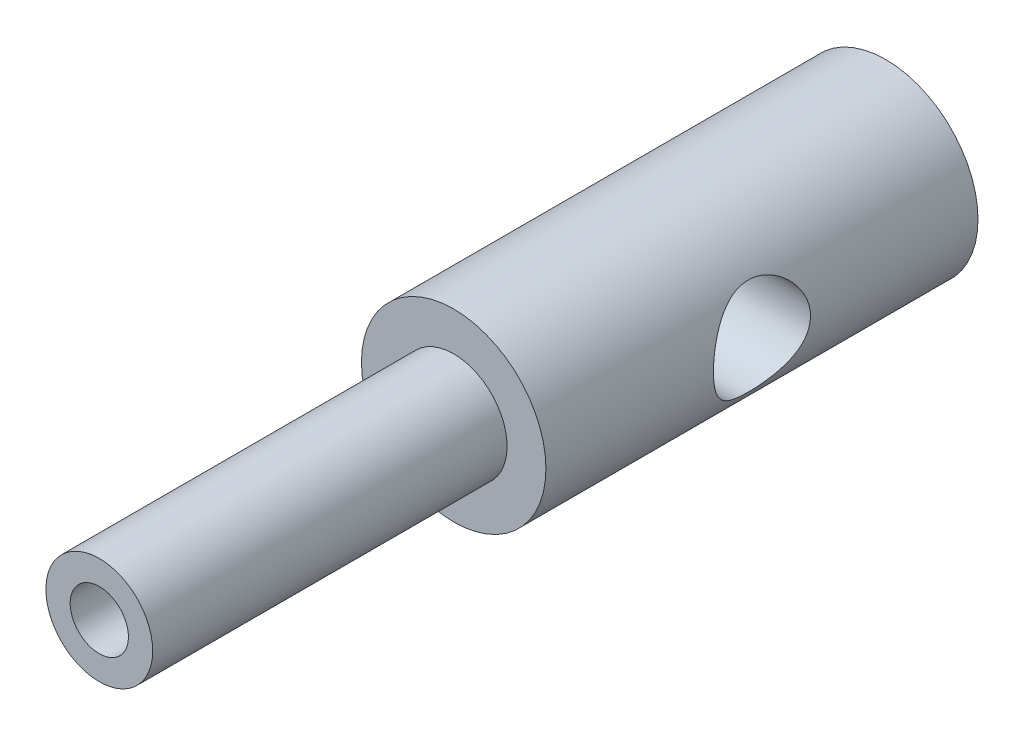
ISO-10303-21;
HEADER;
FILE_DESCRIPTION(('STEP AP214'),'2;1');
FILE_NAME('part.step','',(''),(''),'','','');
FILE_SCHEMA(('AUTOMOTIVE_DESIGN { 1 0 10303 214 1 1 1 1 }'));
ENDSEC;
DATA;
#1=APPLICATION_CONTEXT('core data for automotive mechanical design processes');
#2=APPLICATION_PROTOCOL_DEFINITION('international standard','automotive_design',2000,#1);
#3=PRODUCT_CONTEXT('',#1,'mechanical');
#4=PRODUCT('Part','Part','',(#3));
#5=PRODUCT_RELATED_PRODUCT_CATEGORY('part','',(#4));
#6=PRODUCT_DEFINITION_FORMATION('','',#4);
#7=PRODUCT_DEFINITION_CONTEXT('part definition',#1,'design');
#8=PRODUCT_DEFINITION('design','',#6,#7);
#9=PRODUCT_DEFINITION_SHAPE('','',#8);
#10=(LENGTH_UNIT() NAMED_UNIT(*) SI_UNIT(.MILLI.,.METRE.));
#11=(NAMED_UNIT(*) PLANE_ANGLE_UNIT() SI_UNIT($,.RADIAN.));
#12=(NAMED_UNIT(*) SI_UNIT($,.STERADIAN.) SOLID_ANGLE_UNIT());
#13=UNCERTAINTY_MEASURE_WITH_UNIT(LENGTH_MEASURE(1.E-05),#10,'distance_accuracy_value','');
#14=(GEOMETRIC_REPRESENTATION_CONTEXT(3) GLOBAL_UNCERTAINTY_ASSIGNED_CONTEXT((#13)) GLOBAL_UNIT_ASSIGNED_CONTEXT((#10,
#11,#12)) REPRESENTATION_CONTEXT('',''));
#15=CARTESIAN_POINT('',(0.,0.,0.));
#16=DIRECTION('',(0.,0.,1.));
#17=DIRECTION('',(1.,0.,0.));
#18=AXIS2_PLACEMENT_3D('',#15,#16,#17);
#19=CARTESIAN_POINT('',(0.,0.,36.6134723107493));
#20=DIRECTION('',(0.,0.,1.));
#21=DIRECTION('',(1.,0.,0.));
#22=AXIS2_PLACEMENT_3D('',#19,#20,#21);
#23=CYLINDRICAL_SURFACE('',#22,1.524);
#24=CARTESIAN_POINT('',(0.,0.,11.303));
#25=DIRECTION('',(0.,0.,1.));
#26=DIRECTION('',(1.,0.,0.));
#27=AXIS2_PLACEMENT_3D('',#24,#25,#26);
#28=CIRCLE('',#27,1.524);
#29=CARTESIAN_POINT('',(1.524,0.,11.303));
#30=VERTEX_POINT('',#29);
#31=EDGE_CURVE('E11',#30,#30,#28,.T.);
#32=ORIENTED_EDGE('',*,*,#31,.F.);
#33=EDGE_LOOP('',(#32));
#34=FACE_BOUND('',#33,.T.);
#35=CARTESIAN_POINT('',(0.,0.,29.845));
#36=DIRECTION('',(0.,0.,1.));
#37=DIRECTION('',(1.,0.,0.));
#38=AXIS2_PLACEMENT_3D('',#35,#36,#37);
#39=CIRCLE('',#38,1.524);
#40=CARTESIAN_POINT('',(1.524,0.,29.845));
#41=VERTEX_POINT('',#40);
#42=EDGE_CURVE('E63',#41,#41,#39,.T.);
#43=ORIENTED_EDGE('',*,*,#42,.T.);
#44=EDGE_LOOP('',(#43));
#45=FACE_BOUND('',#44,.T.);
#46=ADVANCED_FACE('F31',(#34,#45),#23,.F.);
#47=CARTESIAN_POINT('',(0.,1.524,11.303));
#48=DIRECTION('',(0.,0.,-1.));
#49=DIRECTION('',(-1.,0.,0.));
#50=AXIS2_PLACEMENT_3D('',#47,#48,#49);
#51=PLANE('',#50);
#52=ORIENTED_EDGE('',*,*,#31,.T.);
#53=EDGE_LOOP('',(#52));
#54=FACE_BOUND('',#53,.T.);
#55=ADVANCED_FACE('F43',(#54),#51,.F.);
#56=CARTESIAN_POINT('',(0.210398319920231,0.,-1.34864201962109));
#57=DIRECTION('',(0.,-1.,0.));
#58=DIRECTION('',(1.,0.,0.));
#59=AXIS2_PLACEMENT_3D('',#56,#57,#58);
#60=CIRCLE('',#59,10.9723753887063);
#61=TRIMMED_CURVE('',#60,(PARAMETER_VALUE(-1.58997277749052)),
(PARAMETER_VALUE(1.58997277749052)),.T.,.PARAMETER.);
#62=CARTESIAN_POINT('',(0.,0.,-1.34864201962109));
#63=DIRECTION('',(0.,0.,1.));
#64=AXIS1_PLACEMENT('',#62,#63);
#65=SURFACE_OF_REVOLUTION('',#61,#64);
#66=CARTESIAN_POINT('',(0.,0.,-11.303));
#67=DIRECTION('',(0.,0.,1.));
#68=DIRECTION('',(1.,0.,0.));
#69=AXIS2_PLACEMENT_3D('',#66,#67,#68);
#70=CIRCLE('',#69,4.826);
#71=CARTESIAN_POINT('',(4.826,0.,-11.303));
#72=VERTEX_POINT('',#71);
#73=EDGE_CURVE('E37',#72,#72,#70,.T.);
#74=ORIENTED_EDGE('',*,*,#73,.F.);
#75=EDGE_LOOP('',(#74));
#76=FACE_BOUND('',#75,.T.);
#77=CARTESIAN_POINT('',(0.,0.,-12.319));
#78=VERTEX_POINT('',#77);
#79=VERTEX_LOOP('',#78);
#80=FACE_BOUND('',#79,.T.);
#81=ADVANCED_FACE('F40',(#76,#80),#65,.T.);
#82=CARTESIAN_POINT('',(0.,0.,36.6134723107493));
#83=DIRECTION('',(0.,0.,1.));
#84=DIRECTION('',(1.,0.,0.));
#85=AXIS2_PLACEMENT_3D('',#82,#83,#84);
#86=CYLINDRICAL_SURFACE('',#85,4.826);
#87=CARTESIAN_POINT('',(-4.826,0.,-2.54));
#88=CARTESIAN_POINT('',(-4.82599108722361,0.132671727413436,-2.53998970239344));
#89=CARTESIAN_POINT('',(-4.82047125156288,0.265481968353217,-2.52954357726874));
#90=CARTESIAN_POINT('',(-4.79893032203788,0.527119821613084,-2.48824304450853));
#91=CARTESIAN_POINT('',(-4.78289216641369,0.655940606494487,-2.45735547808212));
#92=CARTESIAN_POINT('',(-4.7419816922442,0.905431289774782,-2.37674403171466));
#93=CARTESIAN_POINT('',(-4.71714487204603,1.02613165516498,-2.32709578912966));
#94=CARTESIAN_POINT('',(-4.66086863610746,1.25727953018631,-2.21079285628327));
#95=CARTESIAN_POINT('',(-4.62942930184638,1.36772716631853,-2.14413837588774));
#96=CARTESIAN_POINT('',(-4.56038023318126,1.5832989798215,-1.99082406976726));
#97=CARTESIAN_POINT('',(-4.52250238950114,1.68761176994581,-1.90314624917141));
#98=CARTESIAN_POINT('',(-4.44563295884892,1.88081258984201,-1.71247923080912));
#99=CARTESIAN_POINT('',(-4.4066404564786,1.96968749142896,-1.60947713830809));
#100=CARTESIAN_POINT('',(-4.32795611021071,2.1373780367139,-1.38026510829494));
#101=CARTESIAN_POINT('',(-4.28850606243428,2.21461446655133,-1.25280939787052));
#102=CARTESIAN_POINT('',(-4.2179379601073,2.34625321505091,-0.984350884530217));
#103=CARTESIAN_POINT('',(-4.18681355758633,2.40067294859597,-0.843358514883821));
#104=CARTESIAN_POINT('',(-4.15092654717635,2.46182491483836,-0.629364435915659));
#105=CARTESIAN_POINT('',(-4.14093754389936,2.47854123230209,-0.559963251692714));
#106=CARTESIAN_POINT('',(-4.1243090393974,2.50611551780559,-0.41962701740498));
#107=CARTESIAN_POINT('',(-4.11766766376968,2.51697676445226,-0.348692848945094));
#108=CARTESIAN_POINT('',(-4.10804505946568,2.53265234988395,-0.205965434651406));
#109=CARTESIAN_POINT('',(-4.1050610127179,2.53747134445475,-0.134172893344674));
#110=CARTESIAN_POINT('',(-4.10287559704393,2.54100092747068,0.00959608356973793));
#111=CARTESIAN_POINT('',(-4.10367379235338,2.539712219604,0.0815724970379407));
#112=CARTESIAN_POINT('',(-4.11099346238332,2.52787067626693,0.277161496402171));
#113=CARTESIAN_POINT('',(-4.12124856777439,2.51127256309405,0.400333711927561));
#114=CARTESIAN_POINT('',(-4.15163246424047,2.46070324540304,0.641710718396217));
#115=CARTESIAN_POINT('',(-4.1717650305969,2.42672539793513,0.759913591228928));
#116=CARTESIAN_POINT('',(-4.22001621717023,2.34182911069649,0.991456040571426));
#117=CARTESIAN_POINT('',(-4.24830604698801,2.29054297408753,1.10462387686321));
#118=CARTESIAN_POINT('',(-4.30972258399316,2.17277977330617,1.32130894809646));
#119=CARTESIAN_POINT('',(-4.34285144686724,2.10629593138129,1.42482184811691));
#120=CARTESIAN_POINT('',(-4.41590404440184,1.94900130669127,1.63479698245392));
#121=CARTESIAN_POINT('',(-4.45612325057126,1.85607382057027,1.73957678842223));
#122=CARTESIAN_POINT('',(-4.53504609144926,1.65390878409477,1.93280964630199));
#123=CARTESIAN_POINT('',(-4.57374883592344,1.54466182929683,2.0212532179472));
#124=CARTESIAN_POINT('',(-4.64793424817353,1.30519956619788,2.18407094319797));
#125=CARTESIAN_POINT('',(-4.68311075985481,1.17414752651852,2.25736570848074));
#126=CARTESIAN_POINT('',(-4.74355741798229,0.899262991981225,2.38023808097473));
#127=CARTESIAN_POINT('',(-4.7688361996899,0.755441772593108,2.4298363705033));
#128=CARTESIAN_POINT('',(-4.80471527813416,0.472722667108751,2.49948333378024));
#129=CARTESIAN_POINT('',(-4.81641616290188,0.334514568146813,2.52175772939615));
#130=CARTESIAN_POINT('',(-4.8276865625482,0.0558527783641373,2.54322137881605));
#131=CARTESIAN_POINT('',(-4.82726280425544,-0.0845996240720168,2.5424234332982));
#132=CARTESIAN_POINT('',(-4.81492800330122,-0.350603677123995,2.51891467385047));
#133=CARTESIAN_POINT('',(-4.80402920096687,-0.476380559113346,2.49813470503691));
#134=CARTESIAN_POINT('',(-4.77324084183485,-0.722369844174469,2.43840228679882));
#135=CARTESIAN_POINT('',(-4.75335033850668,-0.842581659958696,2.39944792419428));
#136=CARTESIAN_POINT('',(-4.70570362306431,-1.07768192077833,2.30363604311726));
#137=CARTESIAN_POINT('',(-4.67775740611376,-1.19235248320353,2.2463418336659));
#138=CARTESIAN_POINT('',(-4.61658115367783,-1.41079460303505,2.11599988396211));
#139=CARTESIAN_POINT('',(-4.58334900910351,-1.51456178242331,2.04294585136614));
#140=CARTESIAN_POINT('',(-4.51056899207539,-1.71992089838233,1.87428532218791));
#141=CARTESIAN_POINT('',(-4.47072488885432,-1.82012168188046,1.7771106683904));
#142=CARTESIAN_POINT('',(-4.39161535325803,-2.00349303005818,1.56749253156448));
#143=CARTESIAN_POINT('',(-4.35235045587152,-2.0866486657826,1.4550358058891));
#144=CARTESIAN_POINT('',(-4.27626873612259,-2.23863312746198,1.2092490958132));
#145=CARTESIAN_POINT('',(-4.23976290684386,-2.30622622810844,1.07504960341396));
#146=CARTESIAN_POINT('',(-4.17752001419265,-2.41716789962534,0.794695862482454));
#147=CARTESIAN_POINT('',(-4.15176786635105,-2.46055046020459,0.648558705838511));
#148=CARTESIAN_POINT('',(-4.11739808639077,-2.51760249387967,0.363675373489684));
#149=CARTESIAN_POINT('',(-4.10734939485993,-2.53376580050266,0.225606978035502));
#150=CARTESIAN_POINT('',(-4.10148663761561,-2.54325251426608,-0.0515809174025368));
#151=CARTESIAN_POINT('',(-4.1056637598048,-2.53659006067524,-0.190699713445184));
#152=CARTESIAN_POINT('',(-4.12620301378974,-2.50300230205977,-0.448951627509829));
#153=CARTESIAN_POINT('',(-4.14109936774955,-2.47851068736586,-0.568534724852922));
#154=CARTESIAN_POINT('',(-4.17949142848085,-2.41320402180758,-0.801694164588604));
#155=CARTESIAN_POINT('',(-4.20299020945348,-2.37238313495859,-0.915268342980242));
#156=CARTESIAN_POINT('',(-4.25779154310853,-2.27264506312202,-1.1414706890733));
#157=CARTESIAN_POINT('',(-4.28950382647725,-2.21271932272514,-1.25355163999133));
#158=CARTESIAN_POINT('',(-4.35659981236126,-2.07750163519703,-1.46681674545683));
#159=CARTESIAN_POINT('',(-4.39198548552193,-2.00220141903645,-1.56799499115046));
#160=CARTESIAN_POINT('',(-4.46834947534946,-1.82607748017308,-1.77131408918365));
#161=CARTESIAN_POINT('',(-4.50941880200115,-1.72315801129811,-1.87161677105064));
#162=CARTESIAN_POINT('',(-4.58813890577827,-1.50105472683695,-2.05404906399512));
#163=CARTESIAN_POINT('',(-4.6257875521105,-1.38186088782291,-2.13616739291605));
#164=CARTESIAN_POINT('',(-4.69446936096672,-1.12690740795523,-2.2811267123878));
#165=CARTESIAN_POINT('',(-4.72535358335465,-0.99086185289248,-2.34354494529409));
#166=CARTESIAN_POINT('',(-4.76324157534271,-0.779091866608896,-2.41872771659057));
#167=CARTESIAN_POINT('',(-4.77446007764587,-0.707266167684351,-2.4407064530313));
#168=CARTESIAN_POINT('',(-4.79377695581443,-0.56156955482265,-2.47828286621761));
#169=CARTESIAN_POINT('',(-4.80187710019156,-0.487699825671372,-2.49388416010818));
#170=CARTESIAN_POINT('',(-4.81413367707863,-0.345056283253462,-2.51739912695292));
#171=CARTESIAN_POINT('',(-4.81857144462222,-0.276396846858169,-2.52586263820205));
#172=CARTESIAN_POINT('',(-4.82450696018622,-0.138504200911834,-2.53716581529406));
#173=CARTESIAN_POINT('',(-4.82600465356692,-0.0692709807213348,-2.54000537661881));
#174=CARTESIAN_POINT('',(-4.826,0.,-2.54));
#175=B_SPLINE_CURVE_WITH_KNOTS('',3,(#87,#88,#89,#90,#91,#92,#93,#94,#95,#96,#97,#98,#99,#100,
#101,#102,#103,#104,#105,#106,#107,#108,#109,#110,#111,#112,#113,#114,#115,#116,#117,#118,#119,
#120,#121,#122,#123,#124,#125,#126,#127,#128,#129,#130,#131,#132,#133,#134,#135,#136,#137,#138,
#139,#140,#141,#142,#143,#144,#145,#146,#147,#148,#149,#150,#151,#152,#153,#154,#155,#156,#157,
#158,#159,#160,#161,#162,#163,#164,#165,#166,#167,#168,#169,#170,#171,#172,#173,#174),
.UNSPECIFIED.,.T.,.F.,(4,2,2,2,2,2,2,2,2,2,2,2,2,2,2,2,2,2,2,2,2,2,2,2,2,2,2,2,2,2,2,2,2,2,2,2,
2,2,2,2,2,2,2,4),(0.,0.397746322124852,0.796139429390454,1.19294318340143,1.58974204088334,
2.01230703227597,2.43522962684964,2.89546398653495,3.35534642925026,3.57131730828118,
3.78716712625361,4.0028505212892,4.21850906734589,4.59069978173493,4.96303286273313,
5.34383371635714,5.72480472900837,6.16007486603841,6.59559681142577,7.05576432470947,
7.51552946608198,7.93462648338877,8.35349098753117,8.73556505635372,9.11767935438354,
9.50966949331942,9.90181643076405,10.3354440624032,10.7694498781607,11.230852131371,
11.6916049716728,12.1072345058252,12.5226066275275,12.8899184507141,13.2573616664124,
13.6488257313868,14.0405008991967,14.4868650082089,14.9335052847162,15.3891646870736,
15.6167064519079,15.8441189803958,16.0517876850923,16.259460249165),.UNSPECIFIED.);
#176=CARTESIAN_POINT('',(-4.826,0.,-2.54));
#177=VERTEX_POINT('',#176);
#178=EDGE_CURVE('E66',#177,#177,#175,.T.);
#179=ORIENTED_EDGE('',*,*,#178,.T.);
#180=EDGE_LOOP('',(#179));
#181=FACE_BOUND('',#180,.T.);
#182=CARTESIAN_POINT('',(4.826,0.,-2.54));
#183=CARTESIAN_POINT('',(4.82599108722361,-0.132671727413436,-2.53998970239344));
#184=CARTESIAN_POINT('',(4.82047125156288,-0.265481968353217,-2.52954357726874));
#185=CARTESIAN_POINT('',(4.79893032203788,-0.527119821613084,-2.48824304450853));
#186=CARTESIAN_POINT('',(4.78289216641369,-0.655940606494487,-2.45735547808212));
#187=CARTESIAN_POINT('',(4.7419816922442,-0.905431289774781,-2.37674403171466));
#188=CARTESIAN_POINT('',(4.71714487204603,-1.02613165516498,-2.32709578912966));
#189=CARTESIAN_POINT('',(4.66086863610746,-1.25727953018631,-2.21079285628327));
#190=CARTESIAN_POINT('',(4.62942930184638,-1.36772716631853,-2.14413837588774));
#191=CARTESIAN_POINT('',(4.56038023318127,-1.58329897982149,-1.99082406976726));
#192=CARTESIAN_POINT('',(4.52250238950114,-1.68761176994581,-1.90314624917141));
#193=CARTESIAN_POINT('',(4.44563295884892,-1.88081258984201,-1.71247923080912));
#194=CARTESIAN_POINT('',(4.4066404564786,-1.96968749142896,-1.60947713830809));
#195=CARTESIAN_POINT('',(4.32795611021071,-2.1373780367139,-1.38026510829494));
#196=CARTESIAN_POINT('',(4.28850606243428,-2.21461446655133,-1.25280939787052));
#197=CARTESIAN_POINT('',(4.2179379601073,-2.34625321505091,-0.984350884530217));
#198=CARTESIAN_POINT('',(4.18681355758633,-2.40067294859597,-0.843358514883821));
#199=CARTESIAN_POINT('',(4.15092654717635,-2.46182491483836,-0.629364435915659));
#200=CARTESIAN_POINT('',(4.14093754389936,-2.47854123230209,-0.559963251692714));
#201=CARTESIAN_POINT('',(4.1243090393974,-2.50611551780559,-0.41962701740498));
#202=CARTESIAN_POINT('',(4.11766766376968,-2.51697676445226,-0.348692848945094));
#203=CARTESIAN_POINT('',(4.10804505946568,-2.53265234988395,-0.205965434651406));
#204=CARTESIAN_POINT('',(4.1050610127179,-2.53747134445475,-0.134172893344674));
#205=CARTESIAN_POINT('',(4.10287559704393,-2.54100092747068,0.00959608356973811));
#206=CARTESIAN_POINT('',(4.10367379235338,-2.539712219604,0.0815724970379407));
#207=CARTESIAN_POINT('',(4.11099346238332,-2.52787067626693,0.277161496402171));
#208=CARTESIAN_POINT('',(4.12124856777439,-2.51127256309405,0.400333711927561));
#209=CARTESIAN_POINT('',(4.15163246424047,-2.46070324540304,0.641710718396217));
#210=CARTESIAN_POINT('',(4.1717650305969,-2.42672539793513,0.759913591228928));
#211=CARTESIAN_POINT('',(4.22001621717023,-2.34182911069649,0.991456040571426));
#212=CARTESIAN_POINT('',(4.24830604698801,-2.29054297408753,1.10462387686321));
#213=CARTESIAN_POINT('',(4.30972258399316,-2.17277977330617,1.32130894809646));
#214=CARTESIAN_POINT('',(4.34285144686724,-2.10629593138129,1.42482184811691));
#215=CARTESIAN_POINT('',(4.41590404440184,-1.94900130669127,1.63479698245392));
#216=CARTESIAN_POINT('',(4.45612325057126,-1.85607382057027,1.73957678842222));
#217=CARTESIAN_POINT('',(4.53504609144926,-1.65390878409477,1.93280964630199));
#218=CARTESIAN_POINT('',(4.57374883592344,-1.54466182929683,2.0212532179472));
#219=CARTESIAN_POINT('',(4.64793424817353,-1.30519956619788,2.18407094319797));
#220=CARTESIAN_POINT('',(4.68311075985481,-1.17414752651852,2.25736570848074));
#221=CARTESIAN_POINT('',(4.74355741798229,-0.899262991981224,2.38023808097473));
#222=CARTESIAN_POINT('',(4.7688361996899,-0.755441772593108,2.4298363705033));
#223=CARTESIAN_POINT('',(4.80471527813416,-0.47272266710875,2.49948333378024));
#224=CARTESIAN_POINT('',(4.81641616290188,-0.334514568146813,2.52175772939615));
#225=CARTESIAN_POINT('',(4.8276865625482,-0.0558527783641363,2.54322137881605));
#226=CARTESIAN_POINT('',(4.82726280425544,0.0845996240720178,2.5424234332982));
#227=CARTESIAN_POINT('',(4.81492800330122,0.350603677123996,2.51891467385046));
#228=CARTESIAN_POINT('',(4.80402920096687,0.476380559113348,2.49813470503691));
#229=CARTESIAN_POINT('',(4.77324084183485,0.72236984417447,2.43840228679882));
#230=CARTESIAN_POINT('',(4.75335033850668,0.842581659958697,2.39944792419428));
#231=CARTESIAN_POINT('',(4.70570362306431,1.07768192077834,2.30363604311726));
#232=CARTESIAN_POINT('',(4.67775740611376,1.19235248320353,2.2463418336659));
#233=CARTESIAN_POINT('',(4.61658115367783,1.41079460303505,2.11599988396211));
#234=CARTESIAN_POINT('',(4.58334900910351,1.51456178242331,2.04294585136613));
#235=CARTESIAN_POINT('',(4.51056899207539,1.71992089838233,1.87428532218791));
#236=CARTESIAN_POINT('',(4.47072488885432,1.82012168188046,1.7771106683904));
#237=CARTESIAN_POINT('',(4.39161535325803,2.00349303005818,1.56749253156448));
#238=CARTESIAN_POINT('',(4.35235045587152,2.0866486657826,1.4550358058891));
#239=CARTESIAN_POINT('',(4.27626873612259,2.23863312746198,1.20924909581319));
#240=CARTESIAN_POINT('',(4.23976290684386,2.30622622810844,1.07504960341396));
#241=CARTESIAN_POINT('',(4.17752001419265,2.41716789962534,0.794695862482452));
#242=CARTESIAN_POINT('',(4.15176786635105,2.46055046020459,0.648558705838509));
#243=CARTESIAN_POINT('',(4.11739808639077,2.51760249387967,0.363675373489683));
#244=CARTESIAN_POINT('',(4.10734939485993,2.53376580050266,0.225606978035502));
#245=CARTESIAN_POINT('',(4.10148663761561,2.54325251426608,-0.0515809174025368));
#246=CARTESIAN_POINT('',(4.1056637598048,2.53659006067524,-0.190699713445184));
#247=CARTESIAN_POINT('',(4.12620301378974,2.50300230205977,-0.448951627509829));
#248=CARTESIAN_POINT('',(4.14109936774955,2.47851068736586,-0.568534724852922));
#249=CARTESIAN_POINT('',(4.17949142848085,2.41320402180758,-0.801694164588605));
#250=CARTESIAN_POINT('',(4.20299020945348,2.37238313495858,-0.915268342980242));
#251=CARTESIAN_POINT('',(4.25779154310853,2.27264506312202,-1.1414706890733));
#252=CARTESIAN_POINT('',(4.28950382647725,2.21271932272514,-1.25355163999133));
#253=CARTESIAN_POINT('',(4.35659981236126,2.07750163519703,-1.46681674545683));
#254=CARTESIAN_POINT('',(4.39198548552193,2.00220141903645,-1.56799499115046));
#255=CARTESIAN_POINT('',(4.46834947534946,1.82607748017308,-1.77131408918365));
#256=CARTESIAN_POINT('',(4.50941880200115,1.72315801129811,-1.87161677105064));
#257=CARTESIAN_POINT('',(4.58813890577827,1.50105472683695,-2.05404906399512));
#258=CARTESIAN_POINT('',(4.6257875521105,1.38186088782291,-2.13616739291605));
#259=CARTESIAN_POINT('',(4.69446936096672,1.12690740795523,-2.2811267123878));
#260=CARTESIAN_POINT('',(4.72535358335465,0.99086185289248,-2.34354494529409));
#261=CARTESIAN_POINT('',(4.76324157534271,0.779091866608896,-2.41872771659057));
#262=CARTESIAN_POINT('',(4.77446007764587,0.707266167684351,-2.4407064530313));
#263=CARTESIAN_POINT('',(4.79377695581443,0.561569554822649,-2.47828286621761));
#264=CARTESIAN_POINT('',(4.80187710019156,0.487699825671372,-2.49388416010818));
#265=CARTESIAN_POINT('',(4.81413367707863,0.34505628325346,-2.51739912695292));
#266=CARTESIAN_POINT('',(4.81857144462222,0.276396846858167,-2.52586263820205));
#267=CARTESIAN_POINT('',(4.82450696018622,0.138504200911831,-2.53716581529406));
#268=CARTESIAN_POINT('',(4.82600465356692,0.0692709807213336,-2.54000537661881));
#269=CARTESIAN_POINT('',(4.826,0.,-2.54));
#270=B_SPLINE_CURVE_WITH_KNOTS('',3,(#182,#183,#184,#185,#186,#187,#188,#189,#190,#191,#192,
#193,#194,#195,#196,#197,#198,#199,#200,#201,#202,#203,#204,#205,#206,#207,#208,#209,#210,#211,
#212,#213,#214,#215,#216,#217,#218,#219,#220,#221,#222,#223,#224,#225,#226,#227,#228,#229,#230,
#231,#232,#233,#234,#235,#236,#237,#238,#239,#240,#241,#242,#243,#244,#245,#246,#247,#248,#249,
#250,#251,#252,#253,#254,#255,#256,#257,#258,#259,#260,#261,#262,#263,#264,#265,#266,#267,#268,
#269),.UNSPECIFIED.,.T.,.F.,(4,2,2,2,2,2,2,2,2,2,2,2,2,2,2,2,2,2,2,2,2,2,2,2,2,2,2,2,2,2,2,2,2,
2,2,2,2,2,2,2,2,2,2,4),(0.,0.397746322124852,0.796139429390453,1.19294318340143,
1.58974204088334,2.01230703227597,2.43522962684964,2.89546398653495,3.35534642925026,
3.57131730828118,3.78716712625361,4.0028505212892,4.21850906734589,4.59069978173493,
4.96303286273313,5.34383371635714,5.72480472900837,6.16007486603842,6.59559681142577,
7.05576432470948,7.51552946608198,7.93462648338878,8.35349098753117,8.73556505635372,
9.11767935438354,9.50966949331942,9.90181643076405,10.3354440624032,10.7694498781607,
11.230852131371,11.6916049716728,12.1072345058253,12.5226066275275,12.8899184507141,
13.2573616664124,13.6488257313868,14.0405008991967,14.4868650082089,14.9335052847162,
15.3891646870736,15.6167064519079,15.8441189803958,16.0517876850923,16.259460249165),.UNSPECIFIED.);
#271=CARTESIAN_POINT('',(4.826,0.,-2.54));
#272=VERTEX_POINT('',#271);
#273=EDGE_CURVE('E72',#272,#272,#270,.T.);
#274=ORIENTED_EDGE('',*,*,#273,.T.);
#275=EDGE_LOOP('',(#274));
#276=FACE_BOUND('',#275,.T.);
#277=CARTESIAN_POINT('',(0.,0.,11.303));
#278=DIRECTION('',(0.,0.,1.));
#279=DIRECTION('',(1.,0.,0.));
#280=AXIS2_PLACEMENT_3D('',#277,#278,#279);
#281=CIRCLE('',#280,4.826);
#282=CARTESIAN_POINT('',(4.826,0.,11.303));
#283=VERTEX_POINT('',#282);
#284=EDGE_CURVE('E81',#283,#283,#281,.T.);
#285=ORIENTED_EDGE('',*,*,#284,.F.);
#286=EDGE_LOOP('',(#285));
#287=FACE_BOUND('',#286,.T.);
#288=ORIENTED_EDGE('',*,*,#73,.T.);
#289=EDGE_LOOP('',(#288));
#290=FACE_BOUND('',#289,.T.);
#291=ADVANCED_FACE('F42',(#181,#276,#287,#290),#86,.T.);
#292=CARTESIAN_POINT('',(0.,4.826,11.303));
#293=DIRECTION('',(0.,0.,-1.));
#294=DIRECTION('',(-1.,0.,0.));
#295=AXIS2_PLACEMENT_3D('',#292,#293,#294);
#296=PLANE('',#295);
#297=CARTESIAN_POINT('',(0.,0.,11.303));
#298=DIRECTION('',(0.,0.,1.));
#299=DIRECTION('',(1.,0.,0.));
#300=AXIS2_PLACEMENT_3D('',#297,#298,#299);
#301=CIRCLE('',#300,2.794);
#302=CARTESIAN_POINT('',(2.794,0.,11.303));
#303=VERTEX_POINT('',#302);
#304=EDGE_CURVE('E69',#303,#303,#301,.T.);
#305=ORIENTED_EDGE('',*,*,#304,.F.);
#306=EDGE_LOOP('',(#305));
#307=FACE_BOUND('',#306,.T.);
#308=ORIENTED_EDGE('',*,*,#284,.T.);
#309=EDGE_LOOP('',(#308));
#310=FACE_BOUND('',#309,.T.);
#311=ADVANCED_FACE('F50',(#307,#310),#296,.F.);
#312=CARTESIAN_POINT('',(0.,0.,36.6134723107493));
#313=DIRECTION('',(0.,0.,1.));
#314=DIRECTION('',(1.,0.,0.));
#315=AXIS2_PLACEMENT_3D('',#312,#313,#314);
#316=CYLINDRICAL_SURFACE('',#315,2.794);
#317=CARTESIAN_POINT('',(0.,0.,29.845));
#318=DIRECTION('',(0.,0.,1.));
#319=DIRECTION('',(1.,0.,0.));
#320=AXIS2_PLACEMENT_3D('',#317,#318,#319);
#321=CIRCLE('',#320,2.794);
#322=CARTESIAN_POINT('',(2.794,0.,29.845));
#323=VERTEX_POINT('',#322);
#324=EDGE_CURVE('E65',#323,#323,#321,.T.);
#325=ORIENTED_EDGE('',*,*,#324,.F.);
#326=EDGE_LOOP('',(#325));
#327=FACE_BOUND('',#326,.T.);
#328=ORIENTED_EDGE('',*,*,#304,.T.);
#329=EDGE_LOOP('',(#328));
#330=FACE_BOUND('',#329,.T.);
#331=ADVANCED_FACE('F89',(#327,#330),#316,.T.);
#332=CARTESIAN_POINT('',(0.,2.794,29.845));
#333=DIRECTION('',(0.,0.,-1.));
#334=DIRECTION('',(-1.,0.,0.));
#335=AXIS2_PLACEMENT_3D('',#332,#333,#334);
#336=PLANE('',#335);
#337=ORIENTED_EDGE('',*,*,#42,.F.);
#338=EDGE_LOOP('',(#337));
#339=FACE_BOUND('',#338,.T.);
#340=ORIENTED_EDGE('',*,*,#324,.T.);
#341=EDGE_LOOP('',(#340));
#342=FACE_BOUND('',#341,.T.);
#343=ADVANCED_FACE('F95',(#339,#342),#336,.F.);
#344=CARTESIAN_POINT('',(-4.826,0.,0.));
#345=DIRECTION('',(1.,0.,0.));
#346=DIRECTION('',(0.,0.,-1.));
#347=AXIS2_PLACEMENT_3D('',#344,#345,#346);
#348=CYLINDRICAL_SURFACE('',#347,2.54);
#349=ORIENTED_EDGE('',*,*,#178,.F.);
#350=EDGE_LOOP('',(#349));
#351=FACE_BOUND('',#350,.T.);
#352=ORIENTED_EDGE('',*,*,#273,.F.);
#353=EDGE_LOOP('',(#352));
#354=FACE_BOUND('',#353,.T.);
#355=ADVANCED_FACE('F105',(#351,#354),#348,.F.);
#356=CLOSED_SHELL('',(#46,#55,#81,#291,#311,#331,#343,#355));
#357=MANIFOLD_SOLID_BREP('B2',#356);
#358=ADVANCED_BREP_SHAPE_REPRESENTATION('',(#18,#357),#14);
#359=SHAPE_DEFINITION_REPRESENTATION(#9,#358);
ENDSEC;
END-ISO-10303-21;
